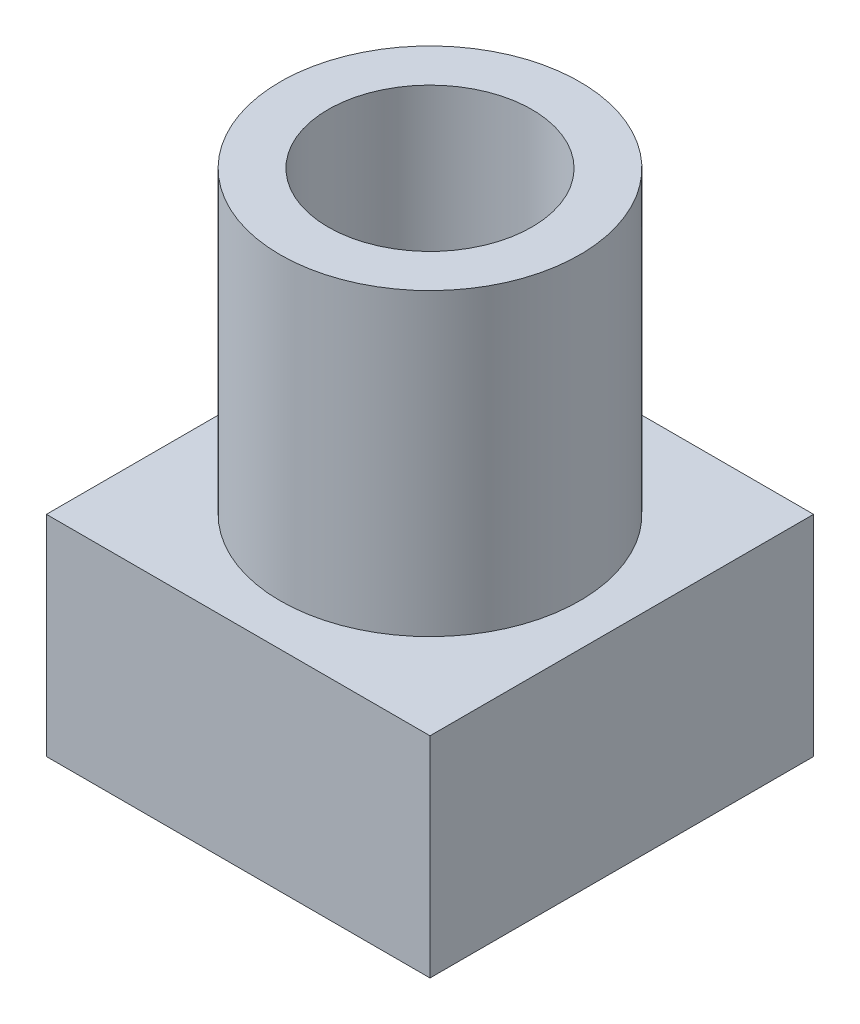
ISO-10303-21;
HEADER;
FILE_DESCRIPTION(('STEP AP214'),'2;1');
FILE_NAME('part.step','',(''),(''),'','','');
FILE_SCHEMA(('AUTOMOTIVE_DESIGN { 1 0 10303 214 1 1 1 1 }'));
ENDSEC;
DATA;
#1=APPLICATION_CONTEXT('core data for automotive mechanical design processes');
#2=APPLICATION_PROTOCOL_DEFINITION('international standard','automotive_design',2000,#1);
#3=PRODUCT_CONTEXT('',#1,'mechanical');
#4=PRODUCT('Part','Part','',(#3));
#5=PRODUCT_RELATED_PRODUCT_CATEGORY('part','',(#4));
#6=PRODUCT_DEFINITION_FORMATION('','',#4);
#7=PRODUCT_DEFINITION_CONTEXT('part definition',#1,'design');
#8=PRODUCT_DEFINITION('design','',#6,#7);
#9=PRODUCT_DEFINITION_SHAPE('','',#8);
#10=(LENGTH_UNIT() NAMED_UNIT(*) SI_UNIT(.MILLI.,.METRE.));
#11=(NAMED_UNIT(*) PLANE_ANGLE_UNIT() SI_UNIT($,.RADIAN.));
#12=(NAMED_UNIT(*) SI_UNIT($,.STERADIAN.) SOLID_ANGLE_UNIT());
#13=UNCERTAINTY_MEASURE_WITH_UNIT(LENGTH_MEASURE(1.E-05),#10,'distance_accuracy_value','');
#14=(GEOMETRIC_REPRESENTATION_CONTEXT(3) GLOBAL_UNCERTAINTY_ASSIGNED_CONTEXT((#13)) GLOBAL_UNIT_ASSIGNED_CONTEXT((#10,
#11,#12)) REPRESENTATION_CONTEXT('',''));
#15=CARTESIAN_POINT('',(0.,0.,0.));
#16=DIRECTION('',(0.,0.,1.));
#17=DIRECTION('',(1.,0.,0.));
#18=AXIS2_PLACEMENT_3D('',#15,#16,#17);
#19=CARTESIAN_POINT('',(-4.064,-4.445,-4.064));
#20=DIRECTION('',(0.,0.,1.));
#21=DIRECTION('',(1.,0.,0.));
#22=AXIS2_PLACEMENT_3D('',#19,#20,#21);
#23=PLANE('',#22);
#24=DIRECTION('',(1.,0.,0.));
#25=VECTOR('',#24,1.);
#26=CARTESIAN_POINT('',(-4.064,0.,-4.064));
#27=LINE('',#26,#25);
#28=CARTESIAN_POINT('',(-4.064,0.,-4.064));
#29=VERTEX_POINT('',#28);
#30=CARTESIAN_POINT('',(4.064,0.,-4.064));
#31=VERTEX_POINT('',#30);
#32=EDGE_CURVE('E169',#29,#31,#27,.T.);
#33=ORIENTED_EDGE('',*,*,#32,.T.);
#34=DIRECTION('',(0.,1.,0.));
#35=VECTOR('',#34,1.);
#36=CARTESIAN_POINT('',(4.064,-4.445,-4.064));
#37=LINE('',#36,#35);
#38=CARTESIAN_POINT('',(4.064,-4.445,-4.064));
#39=VERTEX_POINT('',#38);
#40=EDGE_CURVE('E11',#39,#31,#37,.T.);
#41=ORIENTED_EDGE('',*,*,#40,.F.);
#42=DIRECTION('',(1.,0.,0.));
#43=VECTOR('',#42,1.);
#44=CARTESIAN_POINT('',(-4.064,-4.445,-4.064));
#45=LINE('',#44,#43);
#46=CARTESIAN_POINT('',(-4.064,-4.445,-4.064));
#47=VERTEX_POINT('',#46);
#48=EDGE_CURVE('E97',#47,#39,#45,.T.);
#49=ORIENTED_EDGE('',*,*,#48,.F.);
#50=DIRECTION('',(0.,1.,0.));
#51=VECTOR('',#50,1.);
#52=CARTESIAN_POINT('',(-4.064,-4.445,-4.064));
#53=LINE('',#52,#51);
#54=EDGE_CURVE('E187',#47,#29,#53,.T.);
#55=ORIENTED_EDGE('',*,*,#54,.T.);
#56=EDGE_LOOP('',(#33,#41,#49,#55));
#57=FACE_BOUND('',#56,.T.);
#58=ADVANCED_FACE('F47',(#57),#23,.F.);
#59=CARTESIAN_POINT('',(4.064,-4.445,4.064));
#60=DIRECTION('',(1.,0.,0.));
#61=DIRECTION('',(0.,0.,-1.));
#62=AXIS2_PLACEMENT_3D('',#59,#60,#61);
#63=PLANE('',#62);
#64=DIRECTION('',(0.,0.,-1.));
#65=VECTOR('',#64,1.);
#66=CARTESIAN_POINT('',(4.064,0.,4.064));
#67=LINE('',#66,#65);
#68=CARTESIAN_POINT('',(4.064,0.,4.064));
#69=VERTEX_POINT('',#68);
#70=EDGE_CURVE('E191',#69,#31,#67,.T.);
#71=ORIENTED_EDGE('',*,*,#70,.F.);
#72=DIRECTION('',(0.,1.,0.));
#73=VECTOR('',#72,1.);
#74=CARTESIAN_POINT('',(4.064,-4.445,4.064));
#75=LINE('',#74,#73);
#76=CARTESIAN_POINT('',(4.064,-4.445,4.064));
#77=VERTEX_POINT('',#76);
#78=EDGE_CURVE('E56',#77,#69,#75,.T.);
#79=ORIENTED_EDGE('',*,*,#78,.F.);
#80=DIRECTION('',(0.,0.,-1.));
#81=VECTOR('',#80,1.);
#82=CARTESIAN_POINT('',(4.064,-4.445,4.064));
#83=LINE('',#82,#81);
#84=EDGE_CURVE('E177',#77,#39,#83,.T.);
#85=ORIENTED_EDGE('',*,*,#84,.T.);
#86=ORIENTED_EDGE('',*,*,#40,.T.);
#87=EDGE_LOOP('',(#71,#79,#85,#86));
#88=FACE_BOUND('',#87,.T.);
#89=ADVANCED_FACE('F212',(#88),#63,.T.);
#90=CARTESIAN_POINT('',(-4.064,-4.445,4.064));
#91=DIRECTION('',(0.,0.,1.));
#92=DIRECTION('',(1.,0.,0.));
#93=AXIS2_PLACEMENT_3D('',#90,#91,#92);
#94=PLANE('',#93);
#95=DIRECTION('',(1.,0.,0.));
#96=VECTOR('',#95,1.);
#97=CARTESIAN_POINT('',(-4.064,0.,4.064));
#98=LINE('',#97,#96);
#99=CARTESIAN_POINT('',(-4.064,0.,4.064));
#100=VERTEX_POINT('',#99);
#101=EDGE_CURVE('E195',#100,#69,#98,.T.);
#102=ORIENTED_EDGE('',*,*,#101,.F.);
#103=DIRECTION('',(0.,1.,0.));
#104=VECTOR('',#103,1.);
#105=CARTESIAN_POINT('',(-4.064,-4.445,4.064));
#106=LINE('',#105,#104);
#107=CARTESIAN_POINT('',(-4.064,-4.445,4.064));
#108=VERTEX_POINT('',#107);
#109=EDGE_CURVE('E203',#108,#100,#106,.T.);
#110=ORIENTED_EDGE('',*,*,#109,.F.);
#111=DIRECTION('',(1.,0.,0.));
#112=VECTOR('',#111,1.);
#113=CARTESIAN_POINT('',(-4.064,-4.445,4.064));
#114=LINE('',#113,#112);
#115=EDGE_CURVE('E181',#108,#77,#114,.T.);
#116=ORIENTED_EDGE('',*,*,#115,.T.);
#117=ORIENTED_EDGE('',*,*,#78,.T.);
#118=EDGE_LOOP('',(#102,#110,#116,#117));
#119=FACE_BOUND('',#118,.T.);
#120=ADVANCED_FACE('F210',(#119),#94,.T.);
#121=CARTESIAN_POINT('',(-4.064,-4.445,4.064));
#122=DIRECTION('',(1.,0.,0.));
#123=DIRECTION('',(0.,0.,-1.));
#124=AXIS2_PLACEMENT_3D('',#121,#122,#123);
#125=PLANE('',#124);
#126=DIRECTION('',(0.,0.,-1.));
#127=VECTOR('',#126,1.);
#128=CARTESIAN_POINT('',(-4.064,0.,4.064));
#129=LINE('',#128,#127);
#130=EDGE_CURVE('E92',#100,#29,#129,.T.);
#131=ORIENTED_EDGE('',*,*,#130,.T.);
#132=ORIENTED_EDGE('',*,*,#54,.F.);
#133=DIRECTION('',(0.,0.,-1.));
#134=VECTOR('',#133,1.);
#135=CARTESIAN_POINT('',(-4.064,-4.445,4.064));
#136=LINE('',#135,#134);
#137=EDGE_CURVE('E72',#108,#47,#136,.T.);
#138=ORIENTED_EDGE('',*,*,#137,.F.);
#139=ORIENTED_EDGE('',*,*,#109,.T.);
#140=EDGE_LOOP('',(#131,#132,#138,#139));
#141=FACE_BOUND('',#140,.T.);
#142=ADVANCED_FACE('F217',(#141),#125,.F.);
#143=CARTESIAN_POINT('',(0.,-4.445,0.));
#144=DIRECTION('',(0.,1.,0.));
#145=DIRECTION('',(0.,0.,1.));
#146=AXIS2_PLACEMENT_3D('',#143,#144,#145);
#147=PLANE('',#146);
#148=DIRECTION('',(-1.,0.,0.));
#149=VECTOR('',#148,1.);
#150=CARTESIAN_POINT('',(-3.175,-4.445,3.175));
#151=LINE('',#150,#149);
#152=CARTESIAN_POINT('',(3.175,-4.445,3.175));
#153=VERTEX_POINT('',#152);
#154=CARTESIAN_POINT('',(-3.175,-4.445,3.175));
#155=VERTEX_POINT('',#154);
#156=EDGE_CURVE('E160',#153,#155,#151,.T.);
#157=ORIENTED_EDGE('',*,*,#156,.F.);
#158=DIRECTION('',(0.,0.,1.));
#159=VECTOR('',#158,1.);
#160=CARTESIAN_POINT('',(3.175,-4.445,-3.175));
#161=LINE('',#160,#159);
#162=CARTESIAN_POINT('',(3.175,-4.445,-3.175));
#163=VERTEX_POINT('',#162);
#164=EDGE_CURVE('E63',#163,#153,#161,.T.);
#165=ORIENTED_EDGE('',*,*,#164,.F.);
#166=DIRECTION('',(1.,0.,0.));
#167=VECTOR('',#166,1.);
#168=CARTESIAN_POINT('',(-3.175,-4.445,-3.175));
#169=LINE('',#168,#167);
#170=CARTESIAN_POINT('',(-3.175,-4.445,-3.175));
#171=VERTEX_POINT('',#170);
#172=EDGE_CURVE('E144',#171,#163,#169,.T.);
#173=ORIENTED_EDGE('',*,*,#172,.F.);
#174=DIRECTION('',(0.,0.,-1.));
#175=VECTOR('',#174,1.);
#176=CARTESIAN_POINT('',(-3.175,-4.445,-3.175));
#177=LINE('',#176,#175);
#178=EDGE_CURVE('E148',#155,#171,#177,.T.);
#179=ORIENTED_EDGE('',*,*,#178,.F.);
#180=EDGE_LOOP('',(#157,#165,#173,#179));
#181=FACE_BOUND('',#180,.T.);
#182=ORIENTED_EDGE('',*,*,#48,.T.);
#183=ORIENTED_EDGE('',*,*,#84,.F.);
#184=ORIENTED_EDGE('',*,*,#115,.F.);
#185=ORIENTED_EDGE('',*,*,#137,.T.);
#186=EDGE_LOOP('',(#182,#183,#184,#185));
#187=FACE_BOUND('',#186,.T.);
#188=ADVANCED_FACE('F218',(#181,#187),#147,.F.);
#189=CARTESIAN_POINT('',(0.,0.,0.));
#190=DIRECTION('',(0.,1.,0.));
#191=DIRECTION('',(0.,0.,1.));
#192=AXIS2_PLACEMENT_3D('',#189,#190,#191);
#193=PLANE('',#192);
#194=CARTESIAN_POINT('',(0.,0.,0.));
#195=DIRECTION('',(0.,1.,0.));
#196=DIRECTION('',(0.,0.,1.));
#197=AXIS2_PLACEMENT_3D('',#194,#195,#196);
#198=CIRCLE('',#197,3.175);
#199=CARTESIAN_POINT('',(0.,0.,3.175));
#200=VERTEX_POINT('',#199);
#201=EDGE_CURVE('E151',#200,#200,#198,.T.);
#202=ORIENTED_EDGE('',*,*,#201,.F.);
#203=EDGE_LOOP('',(#202));
#204=FACE_BOUND('',#203,.T.);
#205=ORIENTED_EDGE('',*,*,#32,.F.);
#206=ORIENTED_EDGE('',*,*,#130,.F.);
#207=ORIENTED_EDGE('',*,*,#101,.T.);
#208=ORIENTED_EDGE('',*,*,#70,.T.);
#209=EDGE_LOOP('',(#205,#206,#207,#208));
#210=FACE_BOUND('',#209,.T.);
#211=ADVANCED_FACE('F215',(#204,#210),#193,.T.);
#212=CARTESIAN_POINT('',(3.175,-0.380999999999999,-3.175));
#213=DIRECTION('',(1.,0.,0.));
#214=DIRECTION('',(0.,0.,-1.));
#215=AXIS2_PLACEMENT_3D('',#212,#213,#214);
#216=PLANE('',#215);
#217=ORIENTED_EDGE('',*,*,#164,.T.);
#218=DIRECTION('',(0.,-1.,0.));
#219=VECTOR('',#218,1.);
#220=CARTESIAN_POINT('',(3.175,-0.380999999999999,3.175));
#221=LINE('',#220,#219);
#222=CARTESIAN_POINT('',(3.175,-0.380999999999999,3.175));
#223=VERTEX_POINT('',#222);
#224=EDGE_CURVE('E119',#223,#153,#221,.T.);
#225=ORIENTED_EDGE('',*,*,#224,.F.);
#226=DIRECTION('',(0.,0.,1.));
#227=VECTOR('',#226,1.);
#228=CARTESIAN_POINT('',(3.175,-0.380999999999999,-3.175));
#229=LINE('',#228,#227);
#230=CARTESIAN_POINT('',(3.175,-0.380999999999999,-3.175));
#231=VERTEX_POINT('',#230);
#232=EDGE_CURVE('E123',#231,#223,#229,.T.);
#233=ORIENTED_EDGE('',*,*,#232,.F.);
#234=DIRECTION('',(0.,-1.,0.));
#235=VECTOR('',#234,1.);
#236=CARTESIAN_POINT('',(3.175,-0.380999999999999,-3.175));
#237=LINE('',#236,#235);
#238=EDGE_CURVE('E166',#231,#163,#237,.T.);
#239=ORIENTED_EDGE('',*,*,#238,.T.);
#240=EDGE_LOOP('',(#217,#225,#233,#239));
#241=FACE_BOUND('',#240,.T.);
#242=ADVANCED_FACE('F121',(#241),#216,.F.);
#243=CARTESIAN_POINT('',(-3.175,-0.380999999999999,-3.175));
#244=DIRECTION('',(0.,0.,-1.));
#245=DIRECTION('',(-1.,0.,0.));
#246=AXIS2_PLACEMENT_3D('',#243,#244,#245);
#247=PLANE('',#246);
#248=ORIENTED_EDGE('',*,*,#172,.T.);
#249=ORIENTED_EDGE('',*,*,#238,.F.);
#250=DIRECTION('',(1.,0.,0.));
#251=VECTOR('',#250,1.);
#252=CARTESIAN_POINT('',(-3.175,-0.380999999999999,-3.175));
#253=LINE('',#252,#251);
#254=CARTESIAN_POINT('',(-3.175,-0.380999999999999,-3.175));
#255=VERTEX_POINT('',#254);
#256=EDGE_CURVE('E130',#255,#231,#253,.T.);
#257=ORIENTED_EDGE('',*,*,#256,.F.);
#258=DIRECTION('',(0.,-1.,0.));
#259=VECTOR('',#258,1.);
#260=CARTESIAN_POINT('',(-3.175,-0.380999999999999,-3.175));
#261=LINE('',#260,#259);
#262=EDGE_CURVE('E170',#255,#171,#261,.T.);
#263=ORIENTED_EDGE('',*,*,#262,.T.);
#264=EDGE_LOOP('',(#248,#249,#257,#263));
#265=FACE_BOUND('',#264,.T.);
#266=ADVANCED_FACE('F267',(#265),#247,.F.);
#267=CARTESIAN_POINT('',(-3.175,-0.380999999999999,-3.175));
#268=DIRECTION('',(-1.,0.,0.));
#269=DIRECTION('',(0.,0.,1.));
#270=AXIS2_PLACEMENT_3D('',#267,#268,#269);
#271=PLANE('',#270);
#272=ORIENTED_EDGE('',*,*,#178,.T.);
#273=ORIENTED_EDGE('',*,*,#262,.F.);
#274=DIRECTION('',(0.,0.,-1.));
#275=VECTOR('',#274,1.);
#276=CARTESIAN_POINT('',(-3.175,-0.380999999999999,-3.175));
#277=LINE('',#276,#275);
#278=CARTESIAN_POINT('',(-3.175,-0.380999999999999,3.175));
#279=VERTEX_POINT('',#278);
#280=EDGE_CURVE('E139',#279,#255,#277,.T.);
#281=ORIENTED_EDGE('',*,*,#280,.F.);
#282=DIRECTION('',(0.,-1.,0.));
#283=VECTOR('',#282,1.);
#284=CARTESIAN_POINT('',(-3.175,-0.380999999999999,3.175));
#285=LINE('',#284,#283);
#286=EDGE_CURVE('E129',#279,#155,#285,.T.);
#287=ORIENTED_EDGE('',*,*,#286,.T.);
#288=EDGE_LOOP('',(#272,#273,#281,#287));
#289=FACE_BOUND('',#288,.T.);
#290=ADVANCED_FACE('F275',(#289),#271,.F.);
#291=CARTESIAN_POINT('',(-3.175,-0.380999999999999,3.175));
#292=DIRECTION('',(0.,0.,1.));
#293=DIRECTION('',(1.,0.,0.));
#294=AXIS2_PLACEMENT_3D('',#291,#292,#293);
#295=PLANE('',#294);
#296=ORIENTED_EDGE('',*,*,#156,.T.);
#297=ORIENTED_EDGE('',*,*,#286,.F.);
#298=DIRECTION('',(-1.,0.,0.));
#299=VECTOR('',#298,1.);
#300=CARTESIAN_POINT('',(-3.175,-0.380999999999999,3.175));
#301=LINE('',#300,#299);
#302=EDGE_CURVE('E133',#223,#279,#301,.T.);
#303=ORIENTED_EDGE('',*,*,#302,.F.);
#304=ORIENTED_EDGE('',*,*,#224,.T.);
#305=EDGE_LOOP('',(#296,#297,#303,#304));
#306=FACE_BOUND('',#305,.T.);
#307=ADVANCED_FACE('F134',(#306),#295,.F.);
#308=CARTESIAN_POINT('',(0.,-0.380999999999999,0.));
#309=DIRECTION('',(0.,1.,0.));
#310=DIRECTION('',(0.,0.,1.));
#311=AXIS2_PLACEMENT_3D('',#308,#309,#310);
#312=PLANE('',#311);
#313=CARTESIAN_POINT('',(0.,-0.380999999999999,0.));
#314=DIRECTION('',(0.,1.,0.));
#315=DIRECTION('',(0.,0.,1.));
#316=AXIS2_PLACEMENT_3D('',#313,#314,#315);
#317=CIRCLE('',#316,2.159);
#318=CARTESIAN_POINT('',(0.,-0.380999999999999,2.159));
#319=VERTEX_POINT('',#318);
#320=EDGE_CURVE('E50',#319,#319,#317,.T.);
#321=ORIENTED_EDGE('',*,*,#320,.T.);
#322=EDGE_LOOP('',(#321));
#323=FACE_BOUND('',#322,.T.);
#324=ORIENTED_EDGE('',*,*,#232,.T.);
#325=ORIENTED_EDGE('',*,*,#302,.T.);
#326=ORIENTED_EDGE('',*,*,#280,.T.);
#327=ORIENTED_EDGE('',*,*,#256,.T.);
#328=EDGE_LOOP('',(#324,#325,#326,#327));
#329=FACE_BOUND('',#328,.T.);
#330=ADVANCED_FACE('F141',(#323,#329),#312,.F.);
#331=CARTESIAN_POINT('',(0.,-4.445,0.));
#332=DIRECTION('',(0.,1.,0.));
#333=DIRECTION('',(0.,0.,1.));
#334=AXIS2_PLACEMENT_3D('',#331,#332,#333);
#335=CYLINDRICAL_SURFACE('',#334,2.159);
#336=ORIENTED_EDGE('',*,*,#320,.F.);
#337=EDGE_LOOP('',(#336));
#338=FACE_BOUND('',#337,.T.);
#339=CARTESIAN_POINT('',(0.,6.35,0.));
#340=DIRECTION('',(0.,1.,0.));
#341=DIRECTION('',(0.,0.,1.));
#342=AXIS2_PLACEMENT_3D('',#339,#340,#341);
#343=CIRCLE('',#342,2.159);
#344=CARTESIAN_POINT('',(0.,6.35,2.159));
#345=VERTEX_POINT('',#344);
#346=EDGE_CURVE('E339',#345,#345,#343,.F.);
#347=ORIENTED_EDGE('',*,*,#346,.F.);
#348=EDGE_LOOP('',(#347));
#349=FACE_BOUND('',#348,.T.);
#350=ADVANCED_FACE('F301',(#338,#349),#335,.F.);
#351=CARTESIAN_POINT('',(0.,6.35,0.));
#352=DIRECTION('',(0.,-1.,0.));
#353=DIRECTION('',(0.,0.,-1.));
#354=AXIS2_PLACEMENT_3D('',#351,#352,#353);
#355=CYLINDRICAL_SURFACE('',#354,3.175);
#356=CARTESIAN_POINT('',(0.,6.35,0.));
#357=DIRECTION('',(0.,1.,0.));
#358=DIRECTION('',(0.,0.,1.));
#359=AXIS2_PLACEMENT_3D('',#356,#357,#358);
#360=CIRCLE('',#359,3.175);
#361=CARTESIAN_POINT('',(0.,6.35,3.175));
#362=VERTEX_POINT('',#361);
#363=EDGE_CURVE('E342',#362,#362,#360,.T.);
#364=ORIENTED_EDGE('',*,*,#363,.F.);
#365=EDGE_LOOP('',(#364));
#366=FACE_BOUND('',#365,.T.);
#367=ORIENTED_EDGE('',*,*,#201,.T.);
#368=EDGE_LOOP('',(#367));
#369=FACE_BOUND('',#368,.T.);
#370=ADVANCED_FACE('F310',(#366,#369),#355,.T.);
#371=CARTESIAN_POINT('',(0.,6.35,0.));
#372=DIRECTION('',(0.,1.,0.));
#373=DIRECTION('',(0.,0.,1.));
#374=AXIS2_PLACEMENT_3D('',#371,#372,#373);
#375=PLANE('',#374);
#376=ORIENTED_EDGE('',*,*,#346,.T.);
#377=EDGE_LOOP('',(#376));
#378=FACE_BOUND('',#377,.T.);
#379=ORIENTED_EDGE('',*,*,#363,.T.);
#380=EDGE_LOOP('',(#379));
#381=FACE_BOUND('',#380,.T.);
#382=ADVANCED_FACE('F323',(#378,#381),#375,.T.);
#383=CLOSED_SHELL('',(#58,#89,#120,#142,#188,#211,#242,#266,#290,#307,#330,#350,#370,#382));
#384=MANIFOLD_SOLID_BREP('B2',#383);
#385=ADVANCED_BREP_SHAPE_REPRESENTATION('',(#18,#384),#14);
#386=SHAPE_DEFINITION_REPRESENTATION(#9,#385);
ENDSEC;
END-ISO-10303-21;
